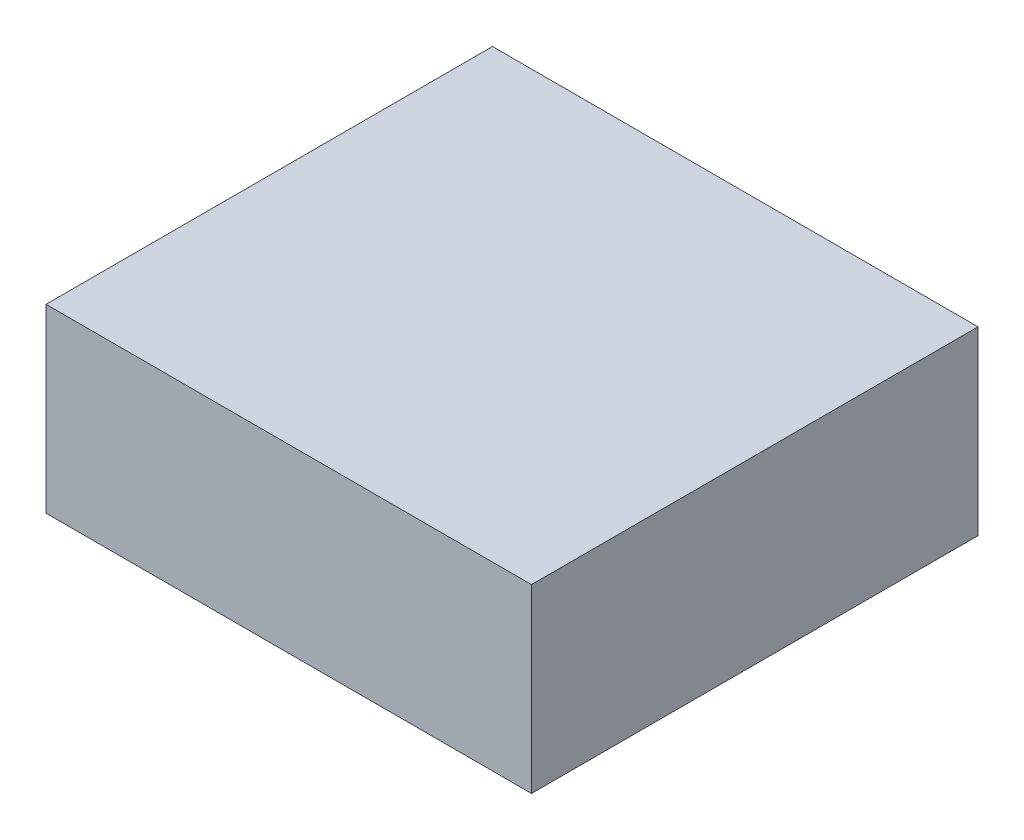
ISO-10303-21;
HEADER;
FILE_DESCRIPTION(('STEP AP214'),'2;1');
FILE_NAME('part.step','',(''),(''),'','','');
FILE_SCHEMA(('AUTOMOTIVE_DESIGN { 1 0 10303 214 1 1 1 1 }'));
ENDSEC;
DATA;
#1=APPLICATION_CONTEXT('core data for automotive mechanical design processes');
#2=APPLICATION_PROTOCOL_DEFINITION('international standard','automotive_design',2000,#1);
#3=PRODUCT_CONTEXT('',#1,'mechanical');
#4=PRODUCT('Part','Part','',(#3));
#5=PRODUCT_RELATED_PRODUCT_CATEGORY('part','',(#4));
#6=PRODUCT_DEFINITION_FORMATION('','',#4);
#7=PRODUCT_DEFINITION_CONTEXT('part definition',#1,'design');
#8=PRODUCT_DEFINITION('design','',#6,#7);
#9=PRODUCT_DEFINITION_SHAPE('','',#8);
#10=(LENGTH_UNIT() NAMED_UNIT(*) SI_UNIT(.MILLI.,.METRE.));
#11=(NAMED_UNIT(*) PLANE_ANGLE_UNIT() SI_UNIT($,.RADIAN.));
#12=(NAMED_UNIT(*) SI_UNIT($,.STERADIAN.) SOLID_ANGLE_UNIT());
#13=UNCERTAINTY_MEASURE_WITH_UNIT(LENGTH_MEASURE(1.E-05),#10,'distance_accuracy_value','');
#14=(GEOMETRIC_REPRESENTATION_CONTEXT(3) GLOBAL_UNCERTAINTY_ASSIGNED_CONTEXT((#13)) GLOBAL_UNIT_ASSIGNED_CONTEXT((#10,
#11,#12)) REPRESENTATION_CONTEXT('',''));
#15=CARTESIAN_POINT('',(0.,0.,0.));
#16=DIRECTION('',(0.,0.,1.));
#17=DIRECTION('',(1.,0.,0.));
#18=AXIS2_PLACEMENT_3D('',#15,#16,#17);
#19=CARTESIAN_POINT('',(0.,140.91239347652,0.));
#20=DIRECTION('',(0.,-1.,0.));
#21=DIRECTION('',(0.,0.,-1.));
#22=AXIS2_PLACEMENT_3D('',#19,#20,#21);
#23=PLANE('',#22);
#24=DIRECTION('',(0.,0.,1.));
#25=VECTOR('',#24,1.);
#26=CARTESIAN_POINT('',(-8.10824398184812,140.91239347652,8.85247190111161));
#27=LINE('',#26,#25);
#28=CARTESIAN_POINT('',(-8.10824398184812,140.91239347652,-70.0922431364489));
#29=VERTEX_POINT('',#28);
#30=CARTESIAN_POINT('',(-8.10824398184812,140.91239347652,8.85247190111161));
#31=VERTEX_POINT('',#30);
#32=EDGE_CURVE('E260',#29,#31,#27,.T.);
#33=ORIENTED_EDGE('',*,*,#32,.T.);
#34=DIRECTION('',(1.,0.,0.));
#35=VECTOR('',#34,1.);
#36=CARTESIAN_POINT('',(-8.10824398184812,140.91239347652,8.85247190111161));
#37=LINE('',#36,#35);
#38=CARTESIAN_POINT('',(77.7295021874928,140.91239347652,8.85247190111161));
#39=VERTEX_POINT('',#38);
#40=EDGE_CURVE('E263',#31,#39,#37,.T.);
#41=ORIENTED_EDGE('',*,*,#40,.T.);
#42=DIRECTION('',(0.,0.,-1.));
#43=VECTOR('',#42,1.);
#44=CARTESIAN_POINT('',(77.7295021874928,140.91239347652,8.85247190111161));
#45=LINE('',#44,#43);
#46=CARTESIAN_POINT('',(77.7295021874928,140.91239347652,-70.0922431364489));
#47=VERTEX_POINT('',#46);
#48=EDGE_CURVE('E266',#39,#47,#45,.T.);
#49=ORIENTED_EDGE('',*,*,#48,.T.);
#50=DIRECTION('',(-1.,0.,0.));
#51=VECTOR('',#50,1.);
#52=CARTESIAN_POINT('',(-8.10824398184812,140.91239347652,-70.0922431364489));
#53=LINE('',#52,#51);
#54=EDGE_CURVE('E269',#47,#29,#53,.T.);
#55=ORIENTED_EDGE('',*,*,#54,.T.);
#56=EDGE_LOOP('',(#33,#41,#49,#55));
#57=FACE_BOUND('',#56,.T.);
#58=ADVANCED_FACE('F43',(#57),#23,.F.);
#59=CARTESIAN_POINT('',(-8.10824398184812,90.9123934765205,8.85247190111161));
#60=DIRECTION('',(0.,0.,1.));
#61=DIRECTION('',(1.,0.,0.));
#62=AXIS2_PLACEMENT_3D('',#59,#60,#61);
#63=PLANE('',#62);
#64=DIRECTION('',(0.,1.,0.));
#65=VECTOR('',#64,1.);
#66=CARTESIAN_POINT('',(-8.10824398184812,90.9123934765205,8.85247190111161));
#67=LINE('',#66,#65);
#68=CARTESIAN_POINT('',(-8.10824398184812,108.929846547517,8.85247190111161));
#69=VERTEX_POINT('',#68);
#70=EDGE_CURVE('E272',#69,#31,#67,.T.);
#71=ORIENTED_EDGE('',*,*,#70,.F.);
#72=DIRECTION('',(1.,0.,0.));
#73=VECTOR('',#72,1.);
#74=CARTESIAN_POINT('',(-8.10824398184812,108.929846547517,8.85247190111161));
#75=LINE('',#74,#73);
#76=CARTESIAN_POINT('',(77.7295021874928,108.929846547517,8.85247190111161));
#77=VERTEX_POINT('',#76);
#78=EDGE_CURVE('E47',#69,#77,#75,.T.);
#79=ORIENTED_EDGE('',*,*,#78,.T.);
#80=DIRECTION('',(0.,1.,0.));
#81=VECTOR('',#80,1.);
#82=CARTESIAN_POINT('',(77.7295021874928,90.9123934765205,8.85247190111161));
#83=LINE('',#82,#81);
#84=EDGE_CURVE('E279',#77,#39,#83,.T.);
#85=ORIENTED_EDGE('',*,*,#84,.T.);
#86=ORIENTED_EDGE('',*,*,#40,.F.);
#87=EDGE_LOOP('',(#71,#79,#85,#86));
#88=FACE_BOUND('',#87,.T.);
#89=ADVANCED_FACE('F295',(#88),#63,.T.);
#90=CARTESIAN_POINT('',(77.7295021874928,90.9123934765205,8.85247190111161));
#91=DIRECTION('',(1.,0.,0.));
#92=DIRECTION('',(0.,0.,-1.));
#93=AXIS2_PLACEMENT_3D('',#90,#91,#92);
#94=PLANE('',#93);
#95=ORIENTED_EDGE('',*,*,#84,.F.);
#96=DIRECTION('',(0.,0.,-1.));
#97=VECTOR('',#96,1.);
#98=CARTESIAN_POINT('',(77.7295021874928,108.929846547517,8.85247190111161));
#99=LINE('',#98,#97);
#100=CARTESIAN_POINT('',(77.7295021874928,108.929846547517,-70.0922431364489));
#101=VERTEX_POINT('',#100);
#102=EDGE_CURVE('E252',#77,#101,#99,.T.);
#103=ORIENTED_EDGE('',*,*,#102,.T.);
#104=DIRECTION('',(0.,1.,0.));
#105=VECTOR('',#104,1.);
#106=CARTESIAN_POINT('',(77.7295021874928,90.9123934765205,-70.0922431364489));
#107=LINE('',#106,#105);
#108=EDGE_CURVE('E276',#101,#47,#107,.T.);
#109=ORIENTED_EDGE('',*,*,#108,.T.);
#110=ORIENTED_EDGE('',*,*,#48,.F.);
#111=EDGE_LOOP('',(#95,#103,#109,#110));
#112=FACE_BOUND('',#111,.T.);
#113=ADVANCED_FACE('F318',(#112),#94,.T.);
#114=CARTESIAN_POINT('',(-8.10824398184812,90.9123934765205,-70.0922431364489));
#115=DIRECTION('',(0.,0.,-1.));
#116=DIRECTION('',(-1.,0.,0.));
#117=AXIS2_PLACEMENT_3D('',#114,#115,#116);
#118=PLANE('',#117);
#119=ORIENTED_EDGE('',*,*,#108,.F.);
#120=DIRECTION('',(-1.,0.,0.));
#121=VECTOR('',#120,1.);
#122=CARTESIAN_POINT('',(-8.10824398184812,108.929846547517,-70.0922431364489));
#123=LINE('',#122,#121);
#124=CARTESIAN_POINT('',(-8.10824398184812,108.929846547517,-70.0922431364489));
#125=VERTEX_POINT('',#124);
#126=EDGE_CURVE('E255',#101,#125,#123,.T.);
#127=ORIENTED_EDGE('',*,*,#126,.T.);
#128=DIRECTION('',(0.,1.,0.));
#129=VECTOR('',#128,1.);
#130=CARTESIAN_POINT('',(-8.10824398184812,90.9123934765205,-70.0922431364489));
#131=LINE('',#130,#129);
#132=EDGE_CURVE('E273',#125,#29,#131,.T.);
#133=ORIENTED_EDGE('',*,*,#132,.T.);
#134=ORIENTED_EDGE('',*,*,#54,.F.);
#135=EDGE_LOOP('',(#119,#127,#133,#134));
#136=FACE_BOUND('',#135,.T.);
#137=ADVANCED_FACE('F305',(#136),#118,.T.);
#138=CARTESIAN_POINT('',(-8.10824398184812,90.9123934765205,8.85247190111161));
#139=DIRECTION('',(-1.,0.,0.));
#140=DIRECTION('',(0.,0.,1.));
#141=AXIS2_PLACEMENT_3D('',#138,#139,#140);
#142=PLANE('',#141);
#143=ORIENTED_EDGE('',*,*,#132,.F.);
#144=DIRECTION('',(0.,0.,1.));
#145=VECTOR('',#144,1.);
#146=CARTESIAN_POINT('',(-8.10824398184812,108.929846547517,8.85247190111161));
#147=LINE('',#146,#145);
#148=EDGE_CURVE('E209',#125,#69,#147,.T.);
#149=ORIENTED_EDGE('',*,*,#148,.T.);
#150=ORIENTED_EDGE('',*,*,#70,.T.);
#151=ORIENTED_EDGE('',*,*,#32,.F.);
#152=EDGE_LOOP('',(#143,#149,#150,#151));
#153=FACE_BOUND('',#152,.T.);
#154=ADVANCED_FACE('F45',(#153),#142,.T.);
#155=CARTESIAN_POINT('',(0.,110.91239347652,0.));
#156=DIRECTION('',(0.,-1.,0.));
#157=DIRECTION('',(0.,0.,-1.));
#158=AXIS2_PLACEMENT_3D('',#155,#156,#157);
#159=PLANE('',#158);
#160=CARTESIAN_POINT('',(58.76,110.91239347652,-12.88));
#161=DIRECTION('',(0.,1.,0.));
#162=DIRECTION('',(0.,0.,1.));
#163=AXIS2_PLACEMENT_3D('',#160,#161,#162);
#164=CIRCLE('',#163,1.55);
#165=CARTESIAN_POINT('',(58.76,110.91239347652,-11.33));
#166=VERTEX_POINT('',#165);
#167=EDGE_CURVE('E207',#166,#166,#164,.T.);
#168=ORIENTED_EDGE('',*,*,#167,.F.);
#169=EDGE_LOOP('',(#168));
#170=FACE_BOUND('',#169,.T.);
#171=ADVANCED_FACE('F354',(#170),#159,.T.);
#172=CARTESIAN_POINT('',(58.76,110.91239347652,-12.88));
#173=DIRECTION('',(0.,1.,0.));
#174=DIRECTION('',(0.,0.,1.));
#175=AXIS2_PLACEMENT_3D('',#172,#173,#174);
#176=CONICAL_SURFACE('',#175,1.55,0.00872664625997167);
#177=CARTESIAN_POINT('',(58.76,120.91239347652,-12.88));
#178=DIRECTION('',(0.,1.,0.));
#179=DIRECTION('',(0.,0.,1.));
#180=AXIS2_PLACEMENT_3D('',#177,#178,#179);
#181=CIRCLE('',#180,1.63726867790759);
#182=CARTESIAN_POINT('',(58.76,120.91239347652,-11.2427313220924));
#183=VERTEX_POINT('',#182);
#184=EDGE_CURVE('E204',#183,#183,#181,.T.);
#185=ORIENTED_EDGE('',*,*,#184,.F.);
#186=EDGE_LOOP('',(#185));
#187=FACE_BOUND('',#186,.T.);
#188=ORIENTED_EDGE('',*,*,#167,.T.);
#189=EDGE_LOOP('',(#188));
#190=FACE_BOUND('',#189,.T.);
#191=ADVANCED_FACE('F350',(#187,#190),#176,.T.);
#192=CARTESIAN_POINT('',(58.76,120.91239347652,-12.88));
#193=DIRECTION('',(0.,1.,0.));
#194=DIRECTION('',(0.,0.,1.));
#195=AXIS2_PLACEMENT_3D('',#192,#193,#194);
#196=PLANE('',#195);
#197=CARTESIAN_POINT('',(58.76,120.91239347652,-12.88));
#198=DIRECTION('',(0.,1.,0.));
#199=DIRECTION('',(0.,0.,1.));
#200=AXIS2_PLACEMENT_3D('',#197,#198,#199);
#201=CIRCLE('',#200,3.36273132209242);
#202=CARTESIAN_POINT('',(58.76,120.91239347652,-9.51726867790758));
#203=VERTEX_POINT('',#202);
#204=EDGE_CURVE('E168',#203,#203,#201,.T.);
#205=ORIENTED_EDGE('',*,*,#204,.F.);
#206=EDGE_LOOP('',(#205));
#207=FACE_BOUND('',#206,.T.);
#208=ORIENTED_EDGE('',*,*,#184,.T.);
#209=EDGE_LOOP('',(#208));
#210=FACE_BOUND('',#209,.T.);
#211=ADVANCED_FACE('F353',(#207,#210),#196,.F.);
#212=CARTESIAN_POINT('',(58.76,110.91239347652,-12.88));
#213=DIRECTION('',(0.,-1.,0.));
#214=DIRECTION('',(0.,0.,1.));
#215=AXIS2_PLACEMENT_3D('',#212,#213,#214);
#216=CONICAL_SURFACE('',#215,3.45,0.00872664625997167);
#217=ORIENTED_EDGE('',*,*,#204,.T.);
#218=EDGE_LOOP('',(#217));
#219=FACE_BOUND('',#218,.T.);
#220=CARTESIAN_POINT('',(58.76,110.91239347652,-12.88));
#221=DIRECTION('',(0.,-1.,0.));
#222=DIRECTION('',(0.,0.,-1.));
#223=AXIS2_PLACEMENT_3D('',#220,#221,#222);
#224=CIRCLE('',#223,3.45);
#225=CARTESIAN_POINT('',(58.76,110.91239347652,-16.33));
#226=VERTEX_POINT('',#225);
#227=EDGE_CURVE('E164',#226,#226,#224,.F.);
#228=ORIENTED_EDGE('',*,*,#227,.F.);
#229=EDGE_LOOP('',(#228));
#230=FACE_BOUND('',#229,.T.);
#231=ADVANCED_FACE('F358',(#219,#230),#216,.F.);
#232=CARTESIAN_POINT('',(17.76,110.91239347652,-12.88));
#233=DIRECTION('',(0.,1.,0.));
#234=DIRECTION('',(0.,0.,-1.));
#235=AXIS2_PLACEMENT_3D('',#232,#233,#234);
#236=CIRCLE('',#235,1.55);
#237=CARTESIAN_POINT('',(17.76,110.91239347652,-14.43));
#238=VERTEX_POINT('',#237);
#239=EDGE_CURVE('E167',#238,#238,#236,.T.);
#240=ORIENTED_EDGE('',*,*,#239,.F.);
#241=EDGE_LOOP('',(#240));
#242=FACE_BOUND('',#241,.T.);
#243=ADVANCED_FACE('F362',(#242),#159,.T.);
#244=CARTESIAN_POINT('',(17.76,110.91239347652,-12.88));
#245=DIRECTION('',(0.,1.,0.));
#246=DIRECTION('',(0.,0.,1.));
#247=AXIS2_PLACEMENT_3D('',#244,#245,#246);
#248=CONICAL_SURFACE('',#247,1.55,0.00872664625997167);
#249=CARTESIAN_POINT('',(17.76,120.91239347652,-12.88));
#250=DIRECTION('',(0.,-1.,0.));
#251=DIRECTION('',(0.,0.,-1.));
#252=AXIS2_PLACEMENT_3D('',#249,#250,#251);
#253=CIRCLE('',#252,1.63726867790759);
#254=CARTESIAN_POINT('',(17.76,120.91239347652,-14.5172686779076));
#255=VERTEX_POINT('',#254);
#256=EDGE_CURVE('E197',#255,#255,#253,.F.);
#257=ORIENTED_EDGE('',*,*,#256,.F.);
#258=EDGE_LOOP('',(#257));
#259=FACE_BOUND('',#258,.T.);
#260=ORIENTED_EDGE('',*,*,#239,.T.);
#261=EDGE_LOOP('',(#260));
#262=FACE_BOUND('',#261,.T.);
#263=ADVANCED_FACE('F364',(#259,#262),#248,.T.);
#264=CARTESIAN_POINT('',(17.76,120.91239347652,-12.88));
#265=DIRECTION('',(0.,-1.,0.));
#266=DIRECTION('',(0.,0.,-1.));
#267=AXIS2_PLACEMENT_3D('',#264,#265,#266);
#268=PLANE('',#267);
#269=CARTESIAN_POINT('',(17.76,120.91239347652,-12.88));
#270=DIRECTION('',(0.,-1.,0.));
#271=DIRECTION('',(0.,0.,-1.));
#272=AXIS2_PLACEMENT_3D('',#269,#270,#271);
#273=CIRCLE('',#272,3.36273132209243);
#274=CARTESIAN_POINT('',(17.76,120.91239347652,-16.2427313220924));
#275=VERTEX_POINT('',#274);
#276=EDGE_CURVE('E163',#275,#275,#273,.F.);
#277=ORIENTED_EDGE('',*,*,#276,.F.);
#278=EDGE_LOOP('',(#277));
#279=FACE_BOUND('',#278,.T.);
#280=ORIENTED_EDGE('',*,*,#256,.T.);
#281=EDGE_LOOP('',(#280));
#282=FACE_BOUND('',#281,.T.);
#283=ADVANCED_FACE('F367',(#279,#282),#268,.T.);
#284=CARTESIAN_POINT('',(17.76,110.91239347652,-12.88));
#285=DIRECTION('',(0.,-1.,0.));
#286=DIRECTION('',(0.,0.,1.));
#287=AXIS2_PLACEMENT_3D('',#284,#285,#286);
#288=CONICAL_SURFACE('',#287,3.45000000000002,0.00872664625997167);
#289=ORIENTED_EDGE('',*,*,#276,.T.);
#290=EDGE_LOOP('',(#289));
#291=FACE_BOUND('',#290,.T.);
#292=CARTESIAN_POINT('',(17.76,110.91239347652,-12.88));
#293=DIRECTION('',(0.,-1.,0.));
#294=DIRECTION('',(0.,0.,-1.));
#295=AXIS2_PLACEMENT_3D('',#292,#293,#294);
#296=CIRCLE('',#295,3.45000000000002);
#297=CARTESIAN_POINT('',(17.76,110.91239347652,-16.33));
#298=VERTEX_POINT('',#297);
#299=EDGE_CURVE('E159',#298,#298,#296,.F.);
#300=ORIENTED_EDGE('',*,*,#299,.F.);
#301=EDGE_LOOP('',(#300));
#302=FACE_BOUND('',#301,.T.);
#303=ADVANCED_FACE('F371',(#291,#302),#288,.F.);
#304=CARTESIAN_POINT('',(58.76,110.91239347652,-48.88));
#305=DIRECTION('',(0.,1.,0.));
#306=DIRECTION('',(0.,0.,-1.));
#307=AXIS2_PLACEMENT_3D('',#304,#305,#306);
#308=CIRCLE('',#307,1.55);
#309=CARTESIAN_POINT('',(58.76,110.91239347652,-50.43));
#310=VERTEX_POINT('',#309);
#311=EDGE_CURVE('E162',#310,#310,#308,.T.);
#312=ORIENTED_EDGE('',*,*,#311,.F.);
#313=EDGE_LOOP('',(#312));
#314=FACE_BOUND('',#313,.T.);
#315=ADVANCED_FACE('F375',(#314),#159,.T.);
#316=CARTESIAN_POINT('',(58.76,110.91239347652,-48.88));
#317=DIRECTION('',(0.,1.,0.));
#318=DIRECTION('',(0.,0.,1.));
#319=AXIS2_PLACEMENT_3D('',#316,#317,#318);
#320=CONICAL_SURFACE('',#319,1.55,0.00872664625997167);
#321=CARTESIAN_POINT('',(58.76,120.91239347652,-48.88));
#322=DIRECTION('',(0.,-1.,0.));
#323=DIRECTION('',(0.,0.,-1.));
#324=AXIS2_PLACEMENT_3D('',#321,#322,#323);
#325=CIRCLE('',#324,1.63726867790759);
#326=CARTESIAN_POINT('',(58.76,120.91239347652,-50.5172686779076));
#327=VERTEX_POINT('',#326);
#328=EDGE_CURVE('E190',#327,#327,#325,.F.);
#329=ORIENTED_EDGE('',*,*,#328,.F.);
#330=EDGE_LOOP('',(#329));
#331=FACE_BOUND('',#330,.T.);
#332=ORIENTED_EDGE('',*,*,#311,.T.);
#333=EDGE_LOOP('',(#332));
#334=FACE_BOUND('',#333,.T.);
#335=ADVANCED_FACE('F377',(#331,#334),#320,.T.);
#336=CARTESIAN_POINT('',(58.76,120.91239347652,-48.88));
#337=DIRECTION('',(0.,-1.,0.));
#338=DIRECTION('',(0.,0.,-1.));
#339=AXIS2_PLACEMENT_3D('',#336,#337,#338);
#340=PLANE('',#339);
#341=CARTESIAN_POINT('',(58.76,120.91239347652,-48.88));
#342=DIRECTION('',(0.,-1.,0.));
#343=DIRECTION('',(0.,0.,-1.));
#344=AXIS2_PLACEMENT_3D('',#341,#342,#343);
#345=CIRCLE('',#344,3.36273132209242);
#346=CARTESIAN_POINT('',(58.76,120.91239347652,-52.2427313220924));
#347=VERTEX_POINT('',#346);
#348=EDGE_CURVE('E158',#347,#347,#345,.F.);
#349=ORIENTED_EDGE('',*,*,#348,.F.);
#350=EDGE_LOOP('',(#349));
#351=FACE_BOUND('',#350,.T.);
#352=ORIENTED_EDGE('',*,*,#328,.T.);
#353=EDGE_LOOP('',(#352));
#354=FACE_BOUND('',#353,.T.);
#355=ADVANCED_FACE('F380',(#351,#354),#340,.T.);
#356=CARTESIAN_POINT('',(58.76,110.91239347652,-48.88));
#357=DIRECTION('',(0.,-1.,0.));
#358=DIRECTION('',(0.,0.,1.));
#359=AXIS2_PLACEMENT_3D('',#356,#357,#358);
#360=CONICAL_SURFACE('',#359,3.45,0.00872664625997167);
#361=ORIENTED_EDGE('',*,*,#348,.T.);
#362=EDGE_LOOP('',(#361));
#363=FACE_BOUND('',#362,.T.);
#364=CARTESIAN_POINT('',(58.76,110.91239347652,-48.88));
#365=DIRECTION('',(0.,-1.,0.));
#366=DIRECTION('',(0.,0.,-1.));
#367=AXIS2_PLACEMENT_3D('',#364,#365,#366);
#368=CIRCLE('',#367,3.45);
#369=CARTESIAN_POINT('',(58.76,110.91239347652,-52.33));
#370=VERTEX_POINT('',#369);
#371=EDGE_CURVE('E154',#370,#370,#368,.F.);
#372=ORIENTED_EDGE('',*,*,#371,.F.);
#373=EDGE_LOOP('',(#372));
#374=FACE_BOUND('',#373,.T.);
#375=ADVANCED_FACE('F384',(#363,#374),#360,.F.);
#376=CARTESIAN_POINT('',(17.76,110.91239347652,-48.88));
#377=DIRECTION('',(0.,1.,0.));
#378=DIRECTION('',(0.,0.,1.));
#379=AXIS2_PLACEMENT_3D('',#376,#377,#378);
#380=CIRCLE('',#379,1.55);
#381=CARTESIAN_POINT('',(17.76,110.91239347652,-47.33));
#382=VERTEX_POINT('',#381);
#383=EDGE_CURVE('E157',#382,#382,#380,.T.);
#384=ORIENTED_EDGE('',*,*,#383,.F.);
#385=EDGE_LOOP('',(#384));
#386=FACE_BOUND('',#385,.T.);
#387=ADVANCED_FACE('F388',(#386),#159,.T.);
#388=CARTESIAN_POINT('',(17.76,110.91239347652,-48.88));
#389=DIRECTION('',(0.,1.,0.));
#390=DIRECTION('',(0.,0.,1.));
#391=AXIS2_PLACEMENT_3D('',#388,#389,#390);
#392=CONICAL_SURFACE('',#391,1.55,0.00872664625997167);
#393=CARTESIAN_POINT('',(17.76,120.91239347652,-48.88));
#394=DIRECTION('',(0.,1.,0.));
#395=DIRECTION('',(0.,0.,1.));
#396=AXIS2_PLACEMENT_3D('',#393,#394,#395);
#397=CIRCLE('',#396,1.63726867790759);
#398=CARTESIAN_POINT('',(17.76,120.91239347652,-47.2427313220924));
#399=VERTEX_POINT('',#398);
#400=EDGE_CURVE('E183',#399,#399,#397,.T.);
#401=ORIENTED_EDGE('',*,*,#400,.F.);
#402=EDGE_LOOP('',(#401));
#403=FACE_BOUND('',#402,.T.);
#404=ORIENTED_EDGE('',*,*,#383,.T.);
#405=EDGE_LOOP('',(#404));
#406=FACE_BOUND('',#405,.T.);
#407=ADVANCED_FACE('F390',(#403,#406),#392,.T.);
#408=CARTESIAN_POINT('',(17.76,120.91239347652,-48.88));
#409=DIRECTION('',(0.,1.,0.));
#410=DIRECTION('',(0.,0.,1.));
#411=AXIS2_PLACEMENT_3D('',#408,#409,#410);
#412=PLANE('',#411);
#413=CARTESIAN_POINT('',(17.76,120.91239347652,-48.88));
#414=DIRECTION('',(0.,1.,0.));
#415=DIRECTION('',(0.,0.,1.));
#416=AXIS2_PLACEMENT_3D('',#413,#414,#415);
#417=CIRCLE('',#416,3.36273132209243);
#418=CARTESIAN_POINT('',(17.76,120.91239347652,-45.5172686779076));
#419=VERTEX_POINT('',#418);
#420=EDGE_CURVE('E153',#419,#419,#417,.T.);
#421=ORIENTED_EDGE('',*,*,#420,.F.);
#422=EDGE_LOOP('',(#421));
#423=FACE_BOUND('',#422,.T.);
#424=ORIENTED_EDGE('',*,*,#400,.T.);
#425=EDGE_LOOP('',(#424));
#426=FACE_BOUND('',#425,.T.);
#427=ADVANCED_FACE('F393',(#423,#426),#412,.F.);
#428=CARTESIAN_POINT('',(17.76,110.91239347652,-48.88));
#429=DIRECTION('',(0.,-1.,0.));
#430=DIRECTION('',(0.,0.,1.));
#431=AXIS2_PLACEMENT_3D('',#428,#429,#430);
#432=CONICAL_SURFACE('',#431,3.45000000000002,0.00872664625997167);
#433=ORIENTED_EDGE('',*,*,#420,.T.);
#434=EDGE_LOOP('',(#433));
#435=FACE_BOUND('',#434,.T.);
#436=CARTESIAN_POINT('',(17.76,110.91239347652,-48.88));
#437=DIRECTION('',(0.,-1.,0.));
#438=DIRECTION('',(0.,0.,-1.));
#439=AXIS2_PLACEMENT_3D('',#436,#437,#438);
#440=CIRCLE('',#439,3.45000000000002);
#441=CARTESIAN_POINT('',(17.76,110.91239347652,-52.33));
#442=VERTEX_POINT('',#441);
#443=EDGE_CURVE('E150',#442,#442,#440,.F.);
#444=ORIENTED_EDGE('',*,*,#443,.F.);
#445=EDGE_LOOP('',(#444));
#446=FACE_BOUND('',#445,.T.);
#447=ADVANCED_FACE('F397',(#435,#446),#432,.F.);
#448=CARTESIAN_POINT('',(4.51,110.91239347652,-57.25));
#449=DIRECTION('',(0.,1.,0.));
#450=DIRECTION('',(0.,0.,1.));
#451=AXIS2_PLACEMENT_3D('',#448,#449,#450);
#452=CONICAL_SURFACE('',#451,1.5,0.00872664625997167);
#453=CARTESIAN_POINT('',(4.51,109.41239347652,-57.25));
#454=DIRECTION('',(0.,1.,0.));
#455=DIRECTION('',(0.,0.,1.));
#456=AXIS2_PLACEMENT_3D('',#453,#454,#455);
#457=CIRCLE('',#456,1.48690969831386);
#458=CARTESIAN_POINT('',(4.51,109.41239347652,-55.7630903016861));
#459=VERTEX_POINT('',#458);
#460=EDGE_CURVE('E149',#459,#459,#457,.F.);
#461=ORIENTED_EDGE('',*,*,#460,.F.);
#462=EDGE_LOOP('',(#461));
#463=FACE_BOUND('',#462,.T.);
#464=CARTESIAN_POINT('',(4.51,110.91239347652,-57.25));
#465=DIRECTION('',(0.,1.,0.));
#466=DIRECTION('',(0.,0.,1.));
#467=AXIS2_PLACEMENT_3D('',#464,#465,#466);
#468=CIRCLE('',#467,1.5);
#469=CARTESIAN_POINT('',(4.51,110.91239347652,-55.75));
#470=VERTEX_POINT('',#469);
#471=EDGE_CURVE('E146',#470,#470,#468,.T.);
#472=ORIENTED_EDGE('',*,*,#471,.F.);
#473=EDGE_LOOP('',(#472));
#474=FACE_BOUND('',#473,.T.);
#475=ADVANCED_FACE('F401',(#463,#474),#452,.T.);
#476=CARTESIAN_POINT('',(62.25,110.91239347652,-57.25));
#477=DIRECTION('',(0.,1.,0.));
#478=DIRECTION('',(0.,0.,1.));
#479=AXIS2_PLACEMENT_3D('',#476,#477,#478);
#480=CONICAL_SURFACE('',#479,1.5,0.00872664625997167);
#481=CARTESIAN_POINT('',(62.25,110.91239347652,-57.25));
#482=DIRECTION('',(0.,1.,0.));
#483=DIRECTION('',(0.,0.,-1.));
#484=AXIS2_PLACEMENT_3D('',#481,#482,#483);
#485=CIRCLE('',#484,1.5);
#486=CARTESIAN_POINT('',(62.25,110.91239347652,-58.75));
#487=VERTEX_POINT('',#486);
#488=EDGE_CURVE('E142',#487,#487,#485,.T.);
#489=ORIENTED_EDGE('',*,*,#488,.F.);
#490=EDGE_LOOP('',(#489));
#491=FACE_BOUND('',#490,.T.);
#492=CARTESIAN_POINT('',(62.25,109.41239347652,-57.25));
#493=DIRECTION('',(0.,-1.,0.));
#494=DIRECTION('',(0.,0.,-1.));
#495=AXIS2_PLACEMENT_3D('',#492,#493,#494);
#496=CIRCLE('',#495,1.48690969831387);
#497=CARTESIAN_POINT('',(62.25,109.41239347652,-58.7369096983139));
#498=VERTEX_POINT('',#497);
#499=EDGE_CURVE('E145',#498,#498,#496,.F.);
#500=ORIENTED_EDGE('',*,*,#499,.T.);
#501=EDGE_LOOP('',(#500));
#502=FACE_BOUND('',#501,.T.);
#503=ADVANCED_FACE('F405',(#491,#502),#480,.T.);
#504=CARTESIAN_POINT('',(62.25,110.91239347652,-4.50999999999999));
#505=DIRECTION('',(0.,1.,0.));
#506=DIRECTION('',(0.,0.,1.));
#507=AXIS2_PLACEMENT_3D('',#504,#505,#506);
#508=CONICAL_SURFACE('',#507,1.5,0.00872664625997167);
#509=CARTESIAN_POINT('',(62.25,109.41239347652,-4.50999999999999));
#510=DIRECTION('',(0.,1.,0.));
#511=DIRECTION('',(0.,0.,1.));
#512=AXIS2_PLACEMENT_3D('',#509,#510,#511);
#513=CIRCLE('',#512,1.48690969831387);
#514=CARTESIAN_POINT('',(62.25,109.41239347652,-3.02309030168613));
#515=VERTEX_POINT('',#514);
#516=EDGE_CURVE('E141',#515,#515,#513,.F.);
#517=ORIENTED_EDGE('',*,*,#516,.F.);
#518=EDGE_LOOP('',(#517));
#519=FACE_BOUND('',#518,.T.);
#520=CARTESIAN_POINT('',(62.25,110.91239347652,-4.50999999999999));
#521=DIRECTION('',(0.,1.,0.));
#522=DIRECTION('',(0.,0.,1.));
#523=AXIS2_PLACEMENT_3D('',#520,#521,#522);
#524=CIRCLE('',#523,1.5);
#525=CARTESIAN_POINT('',(62.25,110.91239347652,-3.00999999999999));
#526=VERTEX_POINT('',#525);
#527=EDGE_CURVE('E138',#526,#526,#524,.T.);
#528=ORIENTED_EDGE('',*,*,#527,.F.);
#529=EDGE_LOOP('',(#528));
#530=FACE_BOUND('',#529,.T.);
#531=ADVANCED_FACE('F409',(#519,#530),#508,.T.);
#532=CARTESIAN_POINT('',(4.51,110.91239347652,-4.51));
#533=DIRECTION('',(0.,1.,0.));
#534=DIRECTION('',(0.,0.,1.));
#535=AXIS2_PLACEMENT_3D('',#532,#533,#534);
#536=CONICAL_SURFACE('',#535,1.5,0.00872664625997167);
#537=CARTESIAN_POINT('',(4.51,110.91239347652,-4.51));
#538=DIRECTION('',(0.,1.,0.));
#539=DIRECTION('',(0.,0.,-1.));
#540=AXIS2_PLACEMENT_3D('',#537,#538,#539);
#541=CIRCLE('',#540,1.5);
#542=CARTESIAN_POINT('',(4.51,110.91239347652,-6.01));
#543=VERTEX_POINT('',#542);
#544=EDGE_CURVE('E134',#543,#543,#541,.T.);
#545=ORIENTED_EDGE('',*,*,#544,.F.);
#546=EDGE_LOOP('',(#545));
#547=FACE_BOUND('',#546,.T.);
#548=CARTESIAN_POINT('',(4.51,109.41239347652,-4.51));
#549=DIRECTION('',(0.,-1.,0.));
#550=DIRECTION('',(0.,0.,-1.));
#551=AXIS2_PLACEMENT_3D('',#548,#549,#550);
#552=CIRCLE('',#551,1.48690969831386);
#553=CARTESIAN_POINT('',(4.51,109.41239347652,-5.99690969831386));
#554=VERTEX_POINT('',#553);
#555=EDGE_CURVE('E137',#554,#554,#552,.F.);
#556=ORIENTED_EDGE('',*,*,#555,.T.);
#557=EDGE_LOOP('',(#556));
#558=FACE_BOUND('',#557,.T.);
#559=ADVANCED_FACE('F413',(#547,#558),#536,.T.);
#560=ORIENTED_EDGE('',*,*,#544,.T.);
#561=EDGE_LOOP('',(#560));
#562=FACE_BOUND('',#561,.T.);
#563=ORIENTED_EDGE('',*,*,#527,.T.);
#564=EDGE_LOOP('',(#563));
#565=FACE_BOUND('',#564,.T.);
#566=ORIENTED_EDGE('',*,*,#488,.T.);
#567=EDGE_LOOP('',(#566));
#568=FACE_BOUND('',#567,.T.);
#569=ORIENTED_EDGE('',*,*,#471,.T.);
#570=EDGE_LOOP('',(#569));
#571=FACE_BOUND('',#570,.T.);
#572=ORIENTED_EDGE('',*,*,#443,.T.);
#573=EDGE_LOOP('',(#572));
#574=FACE_BOUND('',#573,.T.);
#575=ORIENTED_EDGE('',*,*,#371,.T.);
#576=EDGE_LOOP('',(#575));
#577=FACE_BOUND('',#576,.T.);
#578=ORIENTED_EDGE('',*,*,#299,.T.);
#579=EDGE_LOOP('',(#578));
#580=FACE_BOUND('',#579,.T.);
#581=ORIENTED_EDGE('',*,*,#227,.T.);
#582=EDGE_LOOP('',(#581));
#583=FACE_BOUND('',#582,.T.);
#584=DIRECTION('',(0.,0.,1.));
#585=VECTOR('',#584,1.);
#586=CARTESIAN_POINT('',(0.,110.91239347652,0.));
#587=LINE('',#586,#585);
#588=CARTESIAN_POINT('',(0.,110.91239347652,-59.76));
#589=VERTEX_POINT('',#588);
#590=CARTESIAN_POINT('',(0.,110.91239347652,-2.));
#591=VERTEX_POINT('',#590);
#592=EDGE_CURVE('E129',#589,#591,#587,.T.);
#593=ORIENTED_EDGE('',*,*,#592,.F.);
#594=CARTESIAN_POINT('',(2.,110.91239347652,-59.76));
#595=DIRECTION('',(0.,-1.,0.));
#596=DIRECTION('',(0.,0.,-1.));
#597=AXIS2_PLACEMENT_3D('',#594,#595,#596);
#598=CIRCLE('',#597,2.);
#599=CARTESIAN_POINT('',(2.,110.91239347652,-61.76));
#600=VERTEX_POINT('',#599);
#601=EDGE_CURVE('E114',#600,#589,#598,.F.);
#602=ORIENTED_EDGE('',*,*,#601,.F.);
#603=DIRECTION('',(-1.,0.,0.));
#604=VECTOR('',#603,1.);
#605=CARTESIAN_POINT('',(0.,110.91239347652,-61.76));
#606=LINE('',#605,#604);
#607=CARTESIAN_POINT('',(64.76,110.91239347652,-61.76));
#608=VERTEX_POINT('',#607);
#609=EDGE_CURVE('E118',#608,#600,#606,.T.);
#610=ORIENTED_EDGE('',*,*,#609,.F.);
#611=CARTESIAN_POINT('',(64.76,110.91239347652,-59.76));
#612=DIRECTION('',(0.,-1.,0.));
#613=DIRECTION('',(0.,0.,-1.));
#614=AXIS2_PLACEMENT_3D('',#611,#612,#613);
#615=CIRCLE('',#614,2.);
#616=CARTESIAN_POINT('',(66.76,110.91239347652,-59.76));
#617=VERTEX_POINT('',#616);
#618=EDGE_CURVE('E123',#617,#608,#615,.F.);
#619=ORIENTED_EDGE('',*,*,#618,.F.);
#620=DIRECTION('',(0.,0.,-1.));
#621=VECTOR('',#620,1.);
#622=CARTESIAN_POINT('',(66.76,110.91239347652,0.));
#623=LINE('',#622,#621);
#624=CARTESIAN_POINT('',(66.76,110.91239347652,-2.));
#625=VERTEX_POINT('',#624);
#626=EDGE_CURVE('E1051',#625,#617,#623,.T.);
#627=ORIENTED_EDGE('',*,*,#626,.F.);
#628=CARTESIAN_POINT('',(64.76,110.91239347652,-2.));
#629=DIRECTION('',(0.,-1.,0.));
#630=DIRECTION('',(0.,0.,-1.));
#631=AXIS2_PLACEMENT_3D('',#628,#629,#630);
#632=CIRCLE('',#631,2.);
#633=CARTESIAN_POINT('',(64.76,110.91239347652,0.));
#634=VERTEX_POINT('',#633);
#635=EDGE_CURVE('E1054',#634,#625,#632,.F.);
#636=ORIENTED_EDGE('',*,*,#635,.F.);
#637=DIRECTION('',(1.,0.,0.));
#638=VECTOR('',#637,1.);
#639=CARTESIAN_POINT('',(0.,110.91239347652,0.));
#640=LINE('',#639,#638);
#641=CARTESIAN_POINT('',(2.,110.91239347652,0.));
#642=VERTEX_POINT('',#641);
#643=EDGE_CURVE('E1056',#642,#634,#640,.T.);
#644=ORIENTED_EDGE('',*,*,#643,.F.);
#645=CARTESIAN_POINT('',(2.,110.91239347652,-2.));
#646=DIRECTION('',(0.,-1.,0.));
#647=DIRECTION('',(0.,0.,-1.));
#648=AXIS2_PLACEMENT_3D('',#645,#646,#647);
#649=CIRCLE('',#648,2.);
#650=EDGE_CURVE('E1060',#591,#642,#649,.F.);
#651=ORIENTED_EDGE('',*,*,#650,.F.);
#652=EDGE_LOOP('',(#593,#602,#610,#619,#627,#636,#644,#651));
#653=FACE_BOUND('',#652,.T.);
#654=ADVANCED_FACE('F126',(#562,#565,#568,#571,#574,#577,#580,#583,#653),#159,.T.);
#655=CARTESIAN_POINT('',(2.,110.91239347652,-59.76));
#656=DIRECTION('',(0.,-1.,0.));
#657=DIRECTION('',(0.,0.,-1.));
#658=AXIS2_PLACEMENT_3D('',#655,#656,#657);
#659=CONICAL_SURFACE('',#658,2.,0.00872664625997167);
#660=DIRECTION('',(0.,-0.999961923064171,-0.00872653549837395));
#661=VECTOR('',#660,1.);
#662=CARTESIAN_POINT('',(2.,110.929845882958,-61.7598476951564));
#663=LINE('',#662,#661);
#664=CARTESIAN_POINT('',(2.,108.929846547517,-61.7773014249384));
#665=VERTEX_POINT('',#664);
#666=EDGE_CURVE('E110',#665,#600,#663,.F.);
#667=ORIENTED_EDGE('',*,*,#666,.T.);
#668=ORIENTED_EDGE('',*,*,#601,.T.);
#669=DIRECTION('',(-0.00872653549837395,-0.999961923064171,0.));
#670=VECTOR('',#669,1.);
#671=CARTESIAN_POINT('',(0.,110.91239347652,-59.76));
#672=LINE('',#671,#670);
#673=CARTESIAN_POINT('',(-0.0173014249383862,108.929846547517,-59.76));
#674=VERTEX_POINT('',#673);
#675=EDGE_CURVE('E211',#589,#674,#672,.T.);
#676=ORIENTED_EDGE('',*,*,#675,.T.);
#677=CARTESIAN_POINT('',(2.,108.929846547517,-59.76));
#678=DIRECTION('',(0.,-1.,0.));
#679=DIRECTION('',(0.,0.,-1.));
#680=AXIS2_PLACEMENT_3D('',#677,#678,#679);
#681=CIRCLE('',#680,2.01730142493839);
#682=EDGE_CURVE('E116',#665,#674,#681,.F.);
#683=ORIENTED_EDGE('',*,*,#682,.F.);
#684=EDGE_LOOP('',(#667,#668,#676,#683));
#685=FACE_BOUND('',#684,.T.);
#686=ADVANCED_FACE('F111',(#685),#659,.F.);
#687=CARTESIAN_POINT('',(0.,110.91239347652,0.));
#688=DIRECTION('',(-0.999961923064171,0.00872653549837395,0.));
#689=DIRECTION('',(-0.00872653549837395,-0.999961923064171,0.));
#690=AXIS2_PLACEMENT_3D('',#687,#688,#689);
#691=PLANE('',#690);
#692=ORIENTED_EDGE('',*,*,#675,.F.);
#693=ORIENTED_EDGE('',*,*,#592,.T.);
#694=DIRECTION('',(-0.00872653549837395,-0.999961923064171,0.));
#695=VECTOR('',#694,1.);
#696=CARTESIAN_POINT('',(0.,110.91239347652,-2.));
#697=LINE('',#696,#695);
#698=CARTESIAN_POINT('',(-0.0173014249383864,108.929846547517,-2.));
#699=VERTEX_POINT('',#698);
#700=EDGE_CURVE('E217',#699,#591,#697,.F.);
#701=ORIENTED_EDGE('',*,*,#700,.F.);
#702=DIRECTION('',(0.,0.,1.));
#703=VECTOR('',#702,1.);
#704=CARTESIAN_POINT('',(-0.0173014249383863,108.929846547517,0.));
#705=LINE('',#704,#703);
#706=EDGE_CURVE('E213',#674,#699,#705,.T.);
#707=ORIENTED_EDGE('',*,*,#706,.F.);
#708=EDGE_LOOP('',(#692,#693,#701,#707));
#709=FACE_BOUND('',#708,.T.);
#710=ADVANCED_FACE('F423',(#709),#691,.F.);
#711=CARTESIAN_POINT('',(2.,110.91239347652,-2.));
#712=DIRECTION('',(0.,-1.,0.));
#713=DIRECTION('',(0.,0.,-1.));
#714=AXIS2_PLACEMENT_3D('',#711,#712,#713);
#715=CONICAL_SURFACE('',#714,2.,0.00872664625997167);
#716=ORIENTED_EDGE('',*,*,#700,.T.);
#717=ORIENTED_EDGE('',*,*,#650,.T.);
#718=DIRECTION('',(0.,-0.999961923064171,0.00872653549837395));
#719=VECTOR('',#718,1.);
#720=CARTESIAN_POINT('',(2.,110.91239347652,0.));
#721=LINE('',#720,#719);
#722=CARTESIAN_POINT('',(2.,108.929846547517,0.0173014249383864));
#723=VERTEX_POINT('',#722);
#724=EDGE_CURVE('E220',#642,#723,#721,.T.);
#725=ORIENTED_EDGE('',*,*,#724,.T.);
#726=CARTESIAN_POINT('',(2.,108.929846547517,-2.));
#727=DIRECTION('',(0.,-1.,0.));
#728=DIRECTION('',(0.,0.,-1.));
#729=AXIS2_PLACEMENT_3D('',#726,#727,#728);
#730=CIRCLE('',#729,2.01730142493839);
#731=EDGE_CURVE('E219',#699,#723,#730,.F.);
#732=ORIENTED_EDGE('',*,*,#731,.F.);
#733=EDGE_LOOP('',(#716,#717,#725,#732));
#734=FACE_BOUND('',#733,.T.);
#735=ADVANCED_FACE('F426',(#734),#715,.F.);
#736=CARTESIAN_POINT('',(0.,110.91239347652,0.));
#737=DIRECTION('',(0.,0.00872653549837395,0.999961923064171));
#738=DIRECTION('',(0.,-0.999961923064171,0.00872653549837395));
#739=AXIS2_PLACEMENT_3D('',#736,#737,#738);
#740=PLANE('',#739);
#741=ORIENTED_EDGE('',*,*,#724,.F.);
#742=ORIENTED_EDGE('',*,*,#643,.T.);
#743=DIRECTION('',(0.,-0.999961923064171,0.00872653549837395));
#744=VECTOR('',#743,1.);
#745=CARTESIAN_POINT('',(64.76,110.91239347652,0.));
#746=LINE('',#745,#744);
#747=CARTESIAN_POINT('',(64.76,108.929846547517,0.0173014249383864));
#748=VERTEX_POINT('',#747);
#749=EDGE_CURVE('E227',#748,#634,#746,.F.);
#750=ORIENTED_EDGE('',*,*,#749,.F.);
#751=DIRECTION('',(1.,0.,0.));
#752=VECTOR('',#751,1.);
#753=CARTESIAN_POINT('',(0.,108.929846547517,0.0173014249383863));
#754=LINE('',#753,#752);
#755=EDGE_CURVE('E223',#723,#748,#754,.T.);
#756=ORIENTED_EDGE('',*,*,#755,.F.);
#757=EDGE_LOOP('',(#741,#742,#750,#756));
#758=FACE_BOUND('',#757,.T.);
#759=ADVANCED_FACE('F430',(#758),#740,.F.);
#760=CARTESIAN_POINT('',(64.76,110.91239347652,-2.));
#761=DIRECTION('',(0.,-1.,0.));
#762=DIRECTION('',(0.,0.,-1.));
#763=AXIS2_PLACEMENT_3D('',#760,#761,#762);
#764=CONICAL_SURFACE('',#763,2.,0.00872664625997167);
#765=ORIENTED_EDGE('',*,*,#749,.T.);
#766=ORIENTED_EDGE('',*,*,#635,.T.);
#767=DIRECTION('',(0.00872653549837395,-0.999961923064171,0.));
#768=VECTOR('',#767,1.);
#769=CARTESIAN_POINT('',(66.76,110.91239347652,-2.));
#770=LINE('',#769,#768);
#771=CARTESIAN_POINT('',(66.7773014249384,108.929846547517,-2.));
#772=VERTEX_POINT('',#771);
#773=EDGE_CURVE('E230',#625,#772,#770,.T.);
#774=ORIENTED_EDGE('',*,*,#773,.T.);
#775=CARTESIAN_POINT('',(64.76,108.929846547517,-2.));
#776=DIRECTION('',(0.,-1.,0.));
#777=DIRECTION('',(0.,0.,-1.));
#778=AXIS2_PLACEMENT_3D('',#775,#776,#777);
#779=CIRCLE('',#778,2.01730142493839);
#780=EDGE_CURVE('E229',#748,#772,#779,.F.);
#781=ORIENTED_EDGE('',*,*,#780,.F.);
#782=EDGE_LOOP('',(#765,#766,#774,#781));
#783=FACE_BOUND('',#782,.T.);
#784=ADVANCED_FACE('F434',(#783),#764,.F.);
#785=CARTESIAN_POINT('',(66.76,110.91239347652,0.));
#786=DIRECTION('',(0.999961923064171,0.00872653549837395,0.));
#787=DIRECTION('',(-0.00872653549837395,0.999961923064171,0.));
#788=AXIS2_PLACEMENT_3D('',#785,#786,#787);
#789=PLANE('',#788);
#790=ORIENTED_EDGE('',*,*,#773,.F.);
#791=ORIENTED_EDGE('',*,*,#626,.T.);
#792=DIRECTION('',(0.00872653549837395,-0.999961923064171,0.));
#793=VECTOR('',#792,1.);
#794=CARTESIAN_POINT('',(66.76,110.91239347652,-59.76));
#795=LINE('',#794,#793);
#796=CARTESIAN_POINT('',(66.7773014249384,108.929846547517,-59.76));
#797=VERTEX_POINT('',#796);
#798=EDGE_CURVE('E237',#797,#617,#795,.F.);
#799=ORIENTED_EDGE('',*,*,#798,.F.);
#800=DIRECTION('',(0.,0.,-1.));
#801=VECTOR('',#800,1.);
#802=CARTESIAN_POINT('',(66.7773014249384,108.929846547517,0.));
#803=LINE('',#802,#801);
#804=EDGE_CURVE('E233',#772,#797,#803,.T.);
#805=ORIENTED_EDGE('',*,*,#804,.F.);
#806=EDGE_LOOP('',(#790,#791,#799,#805));
#807=FACE_BOUND('',#806,.T.);
#808=ADVANCED_FACE('F438',(#807),#789,.F.);
#809=CARTESIAN_POINT('',(64.76,110.91239347652,-59.76));
#810=DIRECTION('',(0.,-1.,0.));
#811=DIRECTION('',(0.,0.,-1.));
#812=AXIS2_PLACEMENT_3D('',#809,#810,#811);
#813=CONICAL_SURFACE('',#812,2.,0.00872664625997167);
#814=ORIENTED_EDGE('',*,*,#798,.T.);
#815=ORIENTED_EDGE('',*,*,#618,.T.);
#816=DIRECTION('',(0.,-0.999961923064171,-0.00872653549837395));
#817=VECTOR('',#816,1.);
#818=CARTESIAN_POINT('',(64.76,110.929845882958,-61.7598476951564));
#819=LINE('',#818,#817);
#820=CARTESIAN_POINT('',(64.76,108.929846547517,-61.7773014249384));
#821=VERTEX_POINT('',#820);
#822=EDGE_CURVE('E54',#608,#821,#819,.T.);
#823=ORIENTED_EDGE('',*,*,#822,.T.);
#824=CARTESIAN_POINT('',(64.76,108.929846547517,-59.76));
#825=DIRECTION('',(0.,-1.,0.));
#826=DIRECTION('',(0.,0.,-1.));
#827=AXIS2_PLACEMENT_3D('',#824,#825,#826);
#828=CIRCLE('',#827,2.01730142493839);
#829=EDGE_CURVE('E239',#797,#821,#828,.F.);
#830=ORIENTED_EDGE('',*,*,#829,.F.);
#831=EDGE_LOOP('',(#814,#815,#823,#830));
#832=FACE_BOUND('',#831,.T.);
#833=ADVANCED_FACE('F442',(#832),#813,.F.);
#834=CARTESIAN_POINT('',(0.,110.91239347652,-61.76));
#835=DIRECTION('',(0.,0.00872653549837395,-0.999961923064171));
#836=DIRECTION('',(0.,0.999961923064171,0.00872653549837395));
#837=AXIS2_PLACEMENT_3D('',#834,#835,#836);
#838=PLANE('',#837);
#839=ORIENTED_EDGE('',*,*,#822,.F.);
#840=ORIENTED_EDGE('',*,*,#609,.T.);
#841=ORIENTED_EDGE('',*,*,#666,.F.);
#842=DIRECTION('',(-1.,0.,0.));
#843=VECTOR('',#842,1.);
#844=CARTESIAN_POINT('',(0.,108.929846547517,-61.7773014249384));
#845=LINE('',#844,#843);
#846=EDGE_CURVE('E11',#821,#665,#845,.T.);
#847=ORIENTED_EDGE('',*,*,#846,.F.);
#848=EDGE_LOOP('',(#839,#840,#841,#847));
#849=FACE_BOUND('',#848,.T.);
#850=ADVANCED_FACE('F119',(#849),#838,.F.);
#851=CARTESIAN_POINT('',(0.,109.41239347652,0.));
#852=DIRECTION('',(0.,-1.,0.));
#853=DIRECTION('',(0.,0.,-1.));
#854=AXIS2_PLACEMENT_3D('',#851,#852,#853);
#855=PLANE('',#854);
#856=ORIENTED_EDGE('',*,*,#460,.T.);
#857=EDGE_LOOP('',(#856));
#858=FACE_BOUND('',#857,.T.);
#859=ADVANCED_FACE('F345',(#858),#855,.T.);
#860=CARTESIAN_POINT('',(0.,109.41239347652,0.));
#861=DIRECTION('',(0.,1.,0.));
#862=DIRECTION('',(0.,0.,1.));
#863=AXIS2_PLACEMENT_3D('',#860,#861,#862);
#864=PLANE('',#863);
#865=ORIENTED_EDGE('',*,*,#499,.F.);
#866=EDGE_LOOP('',(#865));
#867=FACE_BOUND('',#866,.T.);
#868=ADVANCED_FACE('F341',(#867),#864,.F.);
#869=CARTESIAN_POINT('',(0.,109.41239347652,0.));
#870=DIRECTION('',(0.,-1.,0.));
#871=DIRECTION('',(0.,0.,-1.));
#872=AXIS2_PLACEMENT_3D('',#869,#870,#871);
#873=PLANE('',#872);
#874=ORIENTED_EDGE('',*,*,#516,.T.);
#875=EDGE_LOOP('',(#874));
#876=FACE_BOUND('',#875,.T.);
#877=ADVANCED_FACE('F337',(#876),#873,.T.);
#878=CARTESIAN_POINT('',(0.,109.41239347652,0.));
#879=DIRECTION('',(0.,1.,0.));
#880=DIRECTION('',(0.,0.,1.));
#881=AXIS2_PLACEMENT_3D('',#878,#879,#880);
#882=PLANE('',#881);
#883=ORIENTED_EDGE('',*,*,#555,.F.);
#884=EDGE_LOOP('',(#883));
#885=FACE_BOUND('',#884,.T.);
#886=ADVANCED_FACE('F334',(#885),#882,.F.);
#887=CARTESIAN_POINT('',(-0.0173014249383863,108.929846547517,-59.76));
#888=DIRECTION('',(0.,-1.,0.));
#889=DIRECTION('',(0.,0.,1.));
#890=AXIS2_PLACEMENT_3D('',#887,#888,#889);
#891=PLANE('',#890);
#892=ORIENTED_EDGE('',*,*,#126,.F.);
#893=ORIENTED_EDGE('',*,*,#102,.F.);
#894=ORIENTED_EDGE('',*,*,#78,.F.);
#895=ORIENTED_EDGE('',*,*,#148,.F.);
#896=EDGE_LOOP('',(#892,#893,#894,#895));
#897=FACE_BOUND('',#896,.T.);
#898=ORIENTED_EDGE('',*,*,#804,.T.);
#899=ORIENTED_EDGE('',*,*,#829,.T.);
#900=ORIENTED_EDGE('',*,*,#846,.T.);
#901=ORIENTED_EDGE('',*,*,#682,.T.);
#902=ORIENTED_EDGE('',*,*,#706,.T.);
#903=ORIENTED_EDGE('',*,*,#731,.T.);
#904=ORIENTED_EDGE('',*,*,#755,.T.);
#905=ORIENTED_EDGE('',*,*,#780,.T.);
#906=EDGE_LOOP('',(#898,#899,#900,#901,#902,#903,#904,#905));
#907=FACE_BOUND('',#906,.T.);
#908=ADVANCED_FACE('F316',(#897,#907),#891,.T.);
#909=CLOSED_SHELL('',(#58,#89,#113,#137,#154,#171,#191,#211,#231,#243,#263,#283,#303,#315,#335,
#355,#375,#387,#407,#427,#447,#475,#503,#531,#559,#654,#686,#710,#735,#759,#784,#808,#833,#850,
#859,#868,#877,#886,#908));
#910=MANIFOLD_SOLID_BREP('B2',#909);
#911=ADVANCED_BREP_SHAPE_REPRESENTATION('',(#18,#910),#14);
#912=SHAPE_DEFINITION_REPRESENTATION(#9,#911);
ENDSEC;
END-ISO-10303-21;
